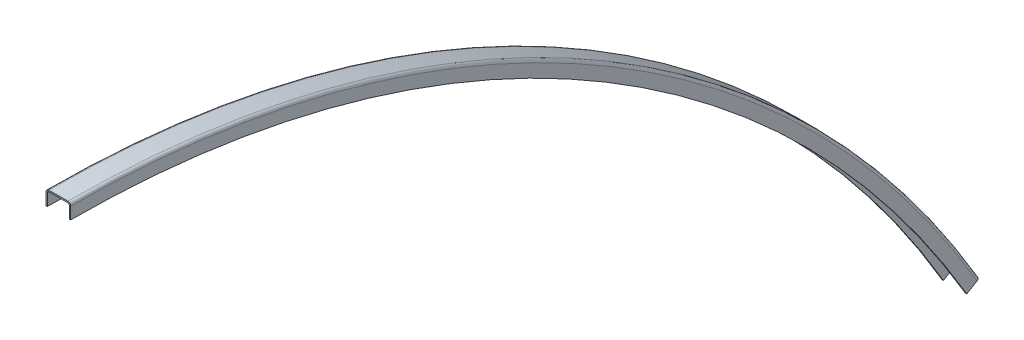
ISO-10303-21;
HEADER;
FILE_DESCRIPTION(('STEP AP214'),'2;1');
FILE_NAME('part.step','',(''),(''),'','','');
FILE_SCHEMA(('AUTOMOTIVE_DESIGN { 1 0 10303 214 1 1 1 1 }'));
ENDSEC;
DATA;
#1=APPLICATION_CONTEXT('core data for automotive mechanical design processes');
#2=APPLICATION_PROTOCOL_DEFINITION('international standard','automotive_design',2000,#1);
#3=PRODUCT_CONTEXT('',#1,'mechanical');
#4=PRODUCT('Part','Part','',(#3));
#5=PRODUCT_RELATED_PRODUCT_CATEGORY('part','',(#4));
#6=PRODUCT_DEFINITION_FORMATION('','',#4);
#7=PRODUCT_DEFINITION_CONTEXT('part definition',#1,'design');
#8=PRODUCT_DEFINITION('design','',#6,#7);
#9=PRODUCT_DEFINITION_SHAPE('','',#8);
#10=(LENGTH_UNIT() NAMED_UNIT(*) SI_UNIT(.MILLI.,.METRE.));
#11=(NAMED_UNIT(*) PLANE_ANGLE_UNIT() SI_UNIT($,.RADIAN.));
#12=(NAMED_UNIT(*) SI_UNIT($,.STERADIAN.) SOLID_ANGLE_UNIT());
#13=UNCERTAINTY_MEASURE_WITH_UNIT(LENGTH_MEASURE(1.E-05),#10,'distance_accuracy_value','');
#14=(GEOMETRIC_REPRESENTATION_CONTEXT(3) GLOBAL_UNCERTAINTY_ASSIGNED_CONTEXT((#13)) GLOBAL_UNIT_ASSIGNED_CONTEXT((#10,
#11,#12)) REPRESENTATION_CONTEXT('',''));
#15=CARTESIAN_POINT('',(0.,0.,0.));
#16=DIRECTION('',(0.,0.,1.));
#17=DIRECTION('',(1.,0.,0.));
#18=AXIS2_PLACEMENT_3D('',#15,#16,#17);
#19=CARTESIAN_POINT('',(14.479414078454,-1435.51851851852,0.));
#20=DIRECTION('',(1.,0.,0.));
#21=DIRECTION('',(0.,0.,-1.));
#22=AXIS2_PLACEMENT_3D('',#19,#20,#21);
#23=CYLINDRICAL_SURFACE('',#22,1473.5);
#24=CARTESIAN_POINT('',(-23.2037037037037,-1435.51851851852,0.));
#25=DIRECTION('',(1.,0.,0.));
#26=DIRECTION('',(0.,0.,-1.));
#27=AXIS2_PLACEMENT_3D('',#24,#25,#26);
#28=CIRCLE('',#27,1473.5);
#29=CARTESIAN_POINT('',(-23.2037037037037,-687.660740695924,-1269.61056791059));
#30=VERTEX_POINT('',#29);
#31=CARTESIAN_POINT('',(-23.2037037037037,37.9814814814815,0.));
#32=VERTEX_POINT('',#31);
#33=EDGE_CURVE('E11',#30,#32,#28,.T.);
#34=ORIENTED_EDGE('',*,*,#33,.F.);
#35=DIRECTION('',(1.,0.,0.));
#36=VECTOR('',#35,1.);
#37=CARTESIAN_POINT('',(-21.2037037037037,-687.660740695924,-1269.61056791059));
#38=LINE('',#37,#36);
#39=CARTESIAN_POINT('',(-21.2037037037037,-687.660740695924,-1269.61056791059));
#40=VERTEX_POINT('',#39);
#41=EDGE_CURVE('E129',#30,#40,#38,.T.);
#42=ORIENTED_EDGE('',*,*,#41,.T.);
#43=CARTESIAN_POINT('',(-21.2037037037037,-1435.51851851852,0.));
#44=DIRECTION('',(1.,0.,0.));
#45=DIRECTION('',(0.,0.,-1.));
#46=AXIS2_PLACEMENT_3D('',#43,#44,#45);
#47=CIRCLE('',#46,1473.5);
#48=CARTESIAN_POINT('',(-21.2037037037037,37.9814814814815,0.));
#49=VERTEX_POINT('',#48);
#50=EDGE_CURVE('E124',#40,#49,#47,.T.);
#51=ORIENTED_EDGE('',*,*,#50,.T.);
#52=DIRECTION('',(1.,0.,0.));
#53=VECTOR('',#52,1.);
#54=CARTESIAN_POINT('',(-21.2037037037037,37.9814814814815,0.));
#55=LINE('',#54,#53);
#56=EDGE_CURVE('E127',#32,#49,#55,.T.);
#57=ORIENTED_EDGE('',*,*,#56,.F.);
#58=EDGE_LOOP('',(#34,#42,#51,#57));
#59=FACE_BOUND('',#58,.T.);
#60=ADVANCED_FACE('F39',(#59),#23,.F.);
#61=CARTESIAN_POINT('',(-23.2037037037037,-687.660740695924,-1269.61056791059));
#62=DIRECTION('',(-1.,0.,0.));
#63=DIRECTION('',(0.,0.,1.));
#64=AXIS2_PLACEMENT_3D('',#61,#62,#63);
#65=PLANE('',#64);
#66=CARTESIAN_POINT('',(-23.2037037037037,-1435.51851851852,0.));
#67=DIRECTION('',(1.,0.,0.));
#68=DIRECTION('',(0.,0.,-1.));
#69=AXIS2_PLACEMENT_3D('',#66,#67,#68);
#70=CIRCLE('',#69,1490.5);
#71=CARTESIAN_POINT('',(-23.2037037037037,-679.032588525592,-1284.2582636381));
#72=VERTEX_POINT('',#71);
#73=CARTESIAN_POINT('',(-23.2037037037037,54.9814814814815,0.));
#74=VERTEX_POINT('',#73);
#75=EDGE_CURVE('E48',#72,#74,#70,.T.);
#76=ORIENTED_EDGE('',*,*,#75,.F.);
#77=DIRECTION('',(0.,-0.507538362960702,0.861629160441527));
#78=VECTOR('',#77,1.);
#79=CARTESIAN_POINT('',(-23.2037037037037,-687.660740695924,-1269.61056791059));
#80=LINE('',#79,#78);
#81=EDGE_CURVE('E135',#72,#30,#80,.T.);
#82=ORIENTED_EDGE('',*,*,#81,.T.);
#83=ORIENTED_EDGE('',*,*,#33,.T.);
#84=DIRECTION('',(0.,-1.,0.));
#85=VECTOR('',#84,1.);
#86=CARTESIAN_POINT('',(-23.2037037037037,37.9814814814815,0.));
#87=LINE('',#86,#85);
#88=EDGE_CURVE('E149',#74,#32,#87,.T.);
#89=ORIENTED_EDGE('',*,*,#88,.F.);
#90=EDGE_LOOP('',(#76,#82,#83,#89));
#91=FACE_BOUND('',#90,.T.);
#92=ADVANCED_FACE('F41',(#91),#65,.T.);
#93=CARTESIAN_POINT('',(-19.2037037037037,-1435.51851851852,0.));
#94=DIRECTION('',(1.,0.,0.));
#95=DIRECTION('',(0.,0.,-1.));
#96=AXIS2_PLACEMENT_3D('',#93,#94,#95);
#97=TOROIDAL_SURFACE('',#96,1490.5,4.);
#98=CARTESIAN_POINT('',(-19.2037037037037,-1435.51851851852,0.));
#99=DIRECTION('',(1.,0.,0.));
#100=DIRECTION('',(0.,0.,-1.));
#101=AXIS2_PLACEMENT_3D('',#98,#99,#100);
#102=CIRCLE('',#101,1494.5);
#103=CARTESIAN_POINT('',(-19.2037037037037,-677.002435073749,-1287.70478027986));
#104=VERTEX_POINT('',#103);
#105=CARTESIAN_POINT('',(-19.2037037037037,58.9814814814815,0.));
#106=VERTEX_POINT('',#105);
#107=EDGE_CURVE('E253',#104,#106,#102,.T.);
#108=ORIENTED_EDGE('',*,*,#107,.F.);
#109=CARTESIAN_POINT('',(-19.2037037037037,-679.032588525592,-1284.2582636381));
#110=DIRECTION('',(0.,0.861629160441527,0.507538362960702));
#111=DIRECTION('',(-1.,0.,0.));
#112=AXIS2_PLACEMENT_3D('',#109,#110,#111);
#113=CIRCLE('',#112,4.);
#114=EDGE_CURVE('E225',#104,#72,#113,.T.);
#115=ORIENTED_EDGE('',*,*,#114,.T.);
#116=ORIENTED_EDGE('',*,*,#75,.T.);
#117=CARTESIAN_POINT('',(-19.2037037037037,54.9814814814815,0.));
#118=DIRECTION('',(0.,0.,1.));
#119=DIRECTION('',(-1.,0.,0.));
#120=AXIS2_PLACEMENT_3D('',#117,#118,#119);
#121=CIRCLE('',#120,4.);
#122=EDGE_CURVE('E183',#106,#74,#121,.T.);
#123=ORIENTED_EDGE('',*,*,#122,.F.);
#124=EDGE_LOOP('',(#108,#115,#116,#123));
#125=FACE_BOUND('',#124,.T.);
#126=ADVANCED_FACE('F258',(#125),#97,.T.);
#127=CARTESIAN_POINT('',(14.479414078454,-1435.51851851852,0.));
#128=DIRECTION('',(1.,0.,0.));
#129=DIRECTION('',(0.,0.,-1.));
#130=AXIS2_PLACEMENT_3D('',#127,#128,#129);
#131=CYLINDRICAL_SURFACE('',#130,1494.5);
#132=CARTESIAN_POINT('',(7.79629629629627,-1435.51851851852,0.));
#133=DIRECTION('',(1.,0.,0.));
#134=DIRECTION('',(0.,0.,-1.));
#135=AXIS2_PLACEMENT_3D('',#132,#133,#134);
#136=CIRCLE('',#135,1494.5);
#137=CARTESIAN_POINT('',(7.79629629629627,-677.002435073749,-1287.70478027986));
#138=VERTEX_POINT('',#137);
#139=CARTESIAN_POINT('',(7.79629629629627,58.9814814814815,0.));
#140=VERTEX_POINT('',#139);
#141=EDGE_CURVE('E250',#138,#140,#136,.T.);
#142=ORIENTED_EDGE('',*,*,#141,.F.);
#143=DIRECTION('',(-1.,0.,0.));
#144=VECTOR('',#143,1.);
#145=CARTESIAN_POINT('',(-19.2037037037037,-677.002435073749,-1287.70478027986));
#146=LINE('',#145,#144);
#147=EDGE_CURVE('E221',#138,#104,#146,.T.);
#148=ORIENTED_EDGE('',*,*,#147,.T.);
#149=ORIENTED_EDGE('',*,*,#107,.T.);
#150=DIRECTION('',(-1.,0.,0.));
#151=VECTOR('',#150,1.);
#152=CARTESIAN_POINT('',(-19.2037037037037,58.9814814814815,0.));
#153=LINE('',#152,#151);
#154=EDGE_CURVE('E179',#140,#106,#153,.T.);
#155=ORIENTED_EDGE('',*,*,#154,.F.);
#156=EDGE_LOOP('',(#142,#148,#149,#155));
#157=FACE_BOUND('',#156,.T.);
#158=ADVANCED_FACE('F293',(#157),#131,.T.);
#159=CARTESIAN_POINT('',(7.79629629629629,-1435.51851851852,0.));
#160=DIRECTION('',(1.,0.,0.));
#161=DIRECTION('',(0.,0.,-1.));
#162=AXIS2_PLACEMENT_3D('',#159,#160,#161);
#163=TOROIDAL_SURFACE('',#162,1490.5,4.);
#164=CARTESIAN_POINT('',(11.7962962962963,-1435.51851851852,0.));
#165=DIRECTION('',(1.,0.,0.));
#166=DIRECTION('',(0.,0.,-1.));
#167=AXIS2_PLACEMENT_3D('',#164,#165,#166);
#168=CIRCLE('',#167,1490.5);
#169=CARTESIAN_POINT('',(11.7962962962963,-679.032588525592,-1284.2582636381));
#170=VERTEX_POINT('',#169);
#171=CARTESIAN_POINT('',(11.7962962962963,54.9814814814815,0.));
#172=VERTEX_POINT('',#171);
#173=EDGE_CURVE('E247',#170,#172,#168,.T.);
#174=ORIENTED_EDGE('',*,*,#173,.F.);
#175=CARTESIAN_POINT('',(7.79629629629629,-679.032588525592,-1284.2582636381));
#176=DIRECTION('',(0.,0.861629160441527,0.507538362960702));
#177=DIRECTION('',(-1.,0.,0.));
#178=AXIS2_PLACEMENT_3D('',#175,#176,#177);
#179=CIRCLE('',#178,4.);
#180=EDGE_CURVE('E217',#170,#138,#179,.T.);
#181=ORIENTED_EDGE('',*,*,#180,.T.);
#182=ORIENTED_EDGE('',*,*,#141,.T.);
#183=CARTESIAN_POINT('',(7.79629629629629,54.9814814814815,0.));
#184=DIRECTION('',(0.,0.,1.));
#185=DIRECTION('',(-1.,0.,0.));
#186=AXIS2_PLACEMENT_3D('',#183,#184,#185);
#187=CIRCLE('',#186,4.);
#188=EDGE_CURVE('E175',#172,#140,#187,.T.);
#189=ORIENTED_EDGE('',*,*,#188,.F.);
#190=EDGE_LOOP('',(#174,#181,#182,#189));
#191=FACE_BOUND('',#190,.T.);
#192=ADVANCED_FACE('F290',(#191),#163,.T.);
#193=CARTESIAN_POINT('',(11.7962962962963,-679.032588525592,-1284.2582636381));
#194=DIRECTION('',(1.,0.,0.));
#195=DIRECTION('',(0.,0.,-1.));
#196=AXIS2_PLACEMENT_3D('',#193,#194,#195);
#197=PLANE('',#196);
#198=CARTESIAN_POINT('',(11.7962962962963,-1435.51851851852,0.));
#199=DIRECTION('',(1.,0.,0.));
#200=DIRECTION('',(0.,0.,-1.));
#201=AXIS2_PLACEMENT_3D('',#198,#199,#200);
#202=CIRCLE('',#201,1473.5);
#203=CARTESIAN_POINT('',(11.7962962962963,-687.660740695924,-1269.61056791059));
#204=VERTEX_POINT('',#203);
#205=CARTESIAN_POINT('',(11.7962962962963,37.9814814814815,0.));
#206=VERTEX_POINT('',#205);
#207=EDGE_CURVE('E244',#204,#206,#202,.T.);
#208=ORIENTED_EDGE('',*,*,#207,.F.);
#209=DIRECTION('',(0.,0.507538362960702,-0.861629160441527));
#210=VECTOR('',#209,1.);
#211=CARTESIAN_POINT('',(11.7962962962963,-679.032588525592,-1284.2582636381));
#212=LINE('',#211,#210);
#213=EDGE_CURVE('E213',#204,#170,#212,.T.);
#214=ORIENTED_EDGE('',*,*,#213,.T.);
#215=ORIENTED_EDGE('',*,*,#173,.T.);
#216=DIRECTION('',(0.,1.,0.));
#217=VECTOR('',#216,1.);
#218=CARTESIAN_POINT('',(11.7962962962963,54.9814814814815,0.));
#219=LINE('',#218,#217);
#220=EDGE_CURVE('E171',#206,#172,#219,.T.);
#221=ORIENTED_EDGE('',*,*,#220,.F.);
#222=EDGE_LOOP('',(#208,#214,#215,#221));
#223=FACE_BOUND('',#222,.T.);
#224=ADVANCED_FACE('F287',(#223),#197,.T.);
#225=CARTESIAN_POINT('',(14.479414078454,-1435.51851851852,0.));
#226=DIRECTION('',(1.,0.,0.));
#227=DIRECTION('',(0.,0.,-1.));
#228=AXIS2_PLACEMENT_3D('',#225,#226,#227);
#229=CYLINDRICAL_SURFACE('',#228,1473.5);
#230=CARTESIAN_POINT('',(9.7962962962963,-1435.51851851852,0.));
#231=DIRECTION('',(1.,0.,0.));
#232=DIRECTION('',(0.,0.,-1.));
#233=AXIS2_PLACEMENT_3D('',#230,#231,#232);
#234=CIRCLE('',#233,1473.5);
#235=CARTESIAN_POINT('',(9.7962962962963,-687.660740695924,-1269.61056791059));
#236=VERTEX_POINT('',#235);
#237=CARTESIAN_POINT('',(9.7962962962963,37.9814814814815,0.));
#238=VERTEX_POINT('',#237);
#239=EDGE_CURVE('E241',#236,#238,#234,.T.);
#240=ORIENTED_EDGE('',*,*,#239,.F.);
#241=DIRECTION('',(1.,0.,0.));
#242=VECTOR('',#241,1.);
#243=CARTESIAN_POINT('',(11.7962962962963,-687.660740695924,-1269.61056791059));
#244=LINE('',#243,#242);
#245=EDGE_CURVE('E209',#236,#204,#244,.T.);
#246=ORIENTED_EDGE('',*,*,#245,.T.);
#247=ORIENTED_EDGE('',*,*,#207,.T.);
#248=DIRECTION('',(1.,0.,0.));
#249=VECTOR('',#248,1.);
#250=CARTESIAN_POINT('',(11.7962962962963,37.9814814814815,0.));
#251=LINE('',#250,#249);
#252=EDGE_CURVE('E167',#238,#206,#251,.T.);
#253=ORIENTED_EDGE('',*,*,#252,.F.);
#254=EDGE_LOOP('',(#240,#246,#247,#253));
#255=FACE_BOUND('',#254,.T.);
#256=ADVANCED_FACE('F282',(#255),#229,.F.);
#257=CARTESIAN_POINT('',(9.7962962962963,-687.660740695924,-1269.61056791059));
#258=DIRECTION('',(-1.,0.,0.));
#259=DIRECTION('',(0.,0.,1.));
#260=AXIS2_PLACEMENT_3D('',#257,#258,#259);
#261=PLANE('',#260);
#262=CARTESIAN_POINT('',(9.7962962962963,-1435.51851851852,0.));
#263=DIRECTION('',(1.,0.,0.));
#264=DIRECTION('',(0.,0.,-1.));
#265=AXIS2_PLACEMENT_3D('',#262,#263,#264);
#266=CIRCLE('',#265,1490.5);
#267=CARTESIAN_POINT('',(9.7962962962963,-679.032588525592,-1284.2582636381));
#268=VERTEX_POINT('',#267);
#269=CARTESIAN_POINT('',(9.7962962962963,54.9814814814815,0.));
#270=VERTEX_POINT('',#269);
#271=EDGE_CURVE('E238',#268,#270,#266,.T.);
#272=ORIENTED_EDGE('',*,*,#271,.F.);
#273=DIRECTION('',(0.,-0.507538362960702,0.861629160441527));
#274=VECTOR('',#273,1.);
#275=CARTESIAN_POINT('',(9.7962962962963,-687.660740695924,-1269.61056791059));
#276=LINE('',#275,#274);
#277=EDGE_CURVE('E205',#268,#236,#276,.T.);
#278=ORIENTED_EDGE('',*,*,#277,.T.);
#279=ORIENTED_EDGE('',*,*,#239,.T.);
#280=DIRECTION('',(0.,-1.,0.));
#281=VECTOR('',#280,1.);
#282=CARTESIAN_POINT('',(9.7962962962963,37.9814814814815,0.));
#283=LINE('',#282,#281);
#284=EDGE_CURVE('E163',#270,#238,#283,.T.);
#285=ORIENTED_EDGE('',*,*,#284,.F.);
#286=EDGE_LOOP('',(#272,#278,#279,#285));
#287=FACE_BOUND('',#286,.T.);
#288=ADVANCED_FACE('F279',(#287),#261,.T.);
#289=CARTESIAN_POINT('',(7.7962962962963,-1435.51851851852,0.));
#290=DIRECTION('',(1.,0.,0.));
#291=DIRECTION('',(0.,0.,-1.));
#292=AXIS2_PLACEMENT_3D('',#289,#290,#291);
#293=TOROIDAL_SURFACE('',#292,1490.5,2.);
#294=CARTESIAN_POINT('',(7.79629629629628,-1435.51851851852,0.));
#295=DIRECTION('',(1.,0.,0.));
#296=DIRECTION('',(0.,0.,-1.));
#297=AXIS2_PLACEMENT_3D('',#294,#295,#296);
#298=CIRCLE('',#297,1492.5);
#299=CARTESIAN_POINT('',(7.79629629629628,-678.01751179967,-1285.98152195898));
#300=VERTEX_POINT('',#299);
#301=CARTESIAN_POINT('',(7.79629629629628,56.9814814814815,0.));
#302=VERTEX_POINT('',#301);
#303=EDGE_CURVE('E235',#300,#302,#298,.T.);
#304=ORIENTED_EDGE('',*,*,#303,.F.);
#305=CARTESIAN_POINT('',(7.7962962962963,-679.032588525592,-1284.2582636381));
#306=DIRECTION('',(0.,-0.861629160441527,-0.507538362960702));
#307=DIRECTION('',(1.,0.,0.));
#308=AXIS2_PLACEMENT_3D('',#305,#306,#307);
#309=CIRCLE('',#308,2.);
#310=EDGE_CURVE('E201',#300,#268,#309,.T.);
#311=ORIENTED_EDGE('',*,*,#310,.T.);
#312=ORIENTED_EDGE('',*,*,#271,.T.);
#313=CARTESIAN_POINT('',(7.7962962962963,54.9814814814815,0.));
#314=DIRECTION('',(0.,0.,-1.));
#315=DIRECTION('',(1.,0.,0.));
#316=AXIS2_PLACEMENT_3D('',#313,#314,#315);
#317=CIRCLE('',#316,2.);
#318=EDGE_CURVE('E159',#302,#270,#317,.T.);
#319=ORIENTED_EDGE('',*,*,#318,.F.);
#320=EDGE_LOOP('',(#304,#311,#312,#319));
#321=FACE_BOUND('',#320,.T.);
#322=ADVANCED_FACE('F274',(#321),#293,.F.);
#323=CARTESIAN_POINT('',(14.479414078454,-1435.51851851852,0.));
#324=DIRECTION('',(1.,0.,0.));
#325=DIRECTION('',(0.,0.,-1.));
#326=AXIS2_PLACEMENT_3D('',#323,#324,#325);
#327=CYLINDRICAL_SURFACE('',#326,1492.5);
#328=CARTESIAN_POINT('',(-19.2037037037037,-1435.51851851852,0.));
#329=DIRECTION('',(1.,0.,0.));
#330=DIRECTION('',(0.,0.,-1.));
#331=AXIS2_PLACEMENT_3D('',#328,#329,#330);
#332=CIRCLE('',#331,1492.5);
#333=CARTESIAN_POINT('',(-19.2037037037037,-678.01751179967,-1285.98152195898));
#334=VERTEX_POINT('',#333);
#335=CARTESIAN_POINT('',(-19.2037037037037,56.9814814814815,0.));
#336=VERTEX_POINT('',#335);
#337=EDGE_CURVE('E232',#334,#336,#332,.T.);
#338=ORIENTED_EDGE('',*,*,#337,.F.);
#339=DIRECTION('',(1.,0.,0.));
#340=VECTOR('',#339,1.);
#341=CARTESIAN_POINT('',(7.79629629629628,-678.01751179967,-1285.98152195898));
#342=LINE('',#341,#340);
#343=EDGE_CURVE('E197',#334,#300,#342,.T.);
#344=ORIENTED_EDGE('',*,*,#343,.T.);
#345=ORIENTED_EDGE('',*,*,#303,.T.);
#346=DIRECTION('',(1.,0.,0.));
#347=VECTOR('',#346,1.);
#348=CARTESIAN_POINT('',(7.79629629629628,56.9814814814815,0.));
#349=LINE('',#348,#347);
#350=EDGE_CURVE('E155',#336,#302,#349,.T.);
#351=ORIENTED_EDGE('',*,*,#350,.F.);
#352=EDGE_LOOP('',(#338,#344,#345,#351));
#353=FACE_BOUND('',#352,.T.);
#354=ADVANCED_FACE('F272',(#353),#327,.F.);
#355=CARTESIAN_POINT('',(-19.2037037037037,-1435.51851851852,0.));
#356=DIRECTION('',(1.,0.,0.));
#357=DIRECTION('',(0.,0.,-1.));
#358=AXIS2_PLACEMENT_3D('',#355,#356,#357);
#359=TOROIDAL_SURFACE('',#358,1490.5,2.);
#360=CARTESIAN_POINT('',(-21.2037037037037,-1435.51851851852,0.));
#361=DIRECTION('',(1.,0.,0.));
#362=DIRECTION('',(0.,0.,-1.));
#363=AXIS2_PLACEMENT_3D('',#360,#361,#362);
#364=CIRCLE('',#363,1490.5);
#365=CARTESIAN_POINT('',(-21.2037037037037,-679.032588525592,-1284.2582636381));
#366=VERTEX_POINT('',#365);
#367=CARTESIAN_POINT('',(-21.2037037037037,54.9814814814815,0.));
#368=VERTEX_POINT('',#367);
#369=EDGE_CURVE('E134',#366,#368,#364,.T.);
#370=ORIENTED_EDGE('',*,*,#369,.F.);
#371=CARTESIAN_POINT('',(-19.2037037037037,-679.032588525592,-1284.2582636381));
#372=DIRECTION('',(0.,-0.861629160441527,-0.507538362960702));
#373=DIRECTION('',(-1.,0.,0.));
#374=AXIS2_PLACEMENT_3D('',#371,#372,#373);
#375=CIRCLE('',#374,2.);
#376=EDGE_CURVE('E193',#366,#334,#375,.T.);
#377=ORIENTED_EDGE('',*,*,#376,.T.);
#378=ORIENTED_EDGE('',*,*,#337,.T.);
#379=CARTESIAN_POINT('',(-19.2037037037037,54.9814814814815,0.));
#380=DIRECTION('',(0.,0.,-1.));
#381=DIRECTION('',(-1.,0.,0.));
#382=AXIS2_PLACEMENT_3D('',#379,#380,#381);
#383=CIRCLE('',#382,2.);
#384=EDGE_CURVE('E144',#368,#336,#383,.T.);
#385=ORIENTED_EDGE('',*,*,#384,.F.);
#386=EDGE_LOOP('',(#370,#377,#378,#385));
#387=FACE_BOUND('',#386,.T.);
#388=ADVANCED_FACE('F268',(#387),#359,.F.);
#389=CARTESIAN_POINT('',(-21.2037037037037,-679.032588525592,-1284.2582636381));
#390=DIRECTION('',(1.,0.,0.));
#391=DIRECTION('',(0.,0.,-1.));
#392=AXIS2_PLACEMENT_3D('',#389,#390,#391);
#393=PLANE('',#392);
#394=DIRECTION('',(0.,0.507538362960702,-0.861629160441527));
#395=VECTOR('',#394,1.);
#396=CARTESIAN_POINT('',(-21.2037037037037,-679.032588525592,-1284.2582636381));
#397=LINE('',#396,#395);
#398=EDGE_CURVE('E190',#40,#366,#397,.T.);
#399=ORIENTED_EDGE('',*,*,#398,.T.);
#400=ORIENTED_EDGE('',*,*,#369,.T.);
#401=DIRECTION('',(0.,1.,0.));
#402=VECTOR('',#401,1.);
#403=CARTESIAN_POINT('',(-21.2037037037037,54.9814814814815,0.));
#404=LINE('',#403,#402);
#405=EDGE_CURVE('E138',#49,#368,#404,.T.);
#406=ORIENTED_EDGE('',*,*,#405,.F.);
#407=ORIENTED_EDGE('',*,*,#50,.F.);
#408=EDGE_LOOP('',(#399,#400,#406,#407));
#409=FACE_BOUND('',#408,.T.);
#410=ADVANCED_FACE('F139',(#409),#393,.T.);
#411=CARTESIAN_POINT('',(-19.2037037037037,-679.032588525592,-1284.2582636381));
#412=DIRECTION('',(0.,-0.861629160441527,-0.507538362960702));
#413=DIRECTION('',(-1.,0.,0.));
#414=AXIS2_PLACEMENT_3D('',#411,#412,#413);
#415=PLANE('',#414);
#416=ORIENTED_EDGE('',*,*,#41,.F.);
#417=ORIENTED_EDGE('',*,*,#81,.F.);
#418=ORIENTED_EDGE('',*,*,#114,.F.);
#419=ORIENTED_EDGE('',*,*,#147,.F.);
#420=ORIENTED_EDGE('',*,*,#180,.F.);
#421=ORIENTED_EDGE('',*,*,#213,.F.);
#422=ORIENTED_EDGE('',*,*,#245,.F.);
#423=ORIENTED_EDGE('',*,*,#277,.F.);
#424=ORIENTED_EDGE('',*,*,#310,.F.);
#425=ORIENTED_EDGE('',*,*,#343,.F.);
#426=ORIENTED_EDGE('',*,*,#376,.F.);
#427=ORIENTED_EDGE('',*,*,#398,.F.);
#428=EDGE_LOOP('',(#416,#417,#418,#419,#420,#421,#422,#423,#424,#425,#426,#427));
#429=FACE_BOUND('',#428,.T.);
#430=ADVANCED_FACE('F263',(#429),#415,.T.);
#431=CARTESIAN_POINT('',(-19.2037037037037,54.9814814814815,0.));
#432=DIRECTION('',(0.,0.,-1.));
#433=DIRECTION('',(-1.,0.,0.));
#434=AXIS2_PLACEMENT_3D('',#431,#432,#433);
#435=PLANE('',#434);
#436=ORIENTED_EDGE('',*,*,#56,.T.);
#437=ORIENTED_EDGE('',*,*,#405,.T.);
#438=ORIENTED_EDGE('',*,*,#384,.T.);
#439=ORIENTED_EDGE('',*,*,#350,.T.);
#440=ORIENTED_EDGE('',*,*,#318,.T.);
#441=ORIENTED_EDGE('',*,*,#284,.T.);
#442=ORIENTED_EDGE('',*,*,#252,.T.);
#443=ORIENTED_EDGE('',*,*,#220,.T.);
#444=ORIENTED_EDGE('',*,*,#188,.T.);
#445=ORIENTED_EDGE('',*,*,#154,.T.);
#446=ORIENTED_EDGE('',*,*,#122,.T.);
#447=ORIENTED_EDGE('',*,*,#88,.T.);
#448=EDGE_LOOP('',(#436,#437,#438,#439,#440,#441,#442,#443,#444,#445,#446,#447));
#449=FACE_BOUND('',#448,.T.);
#450=ADVANCED_FACE('F147',(#449),#435,.F.);
#451=CLOSED_SHELL('',(#60,#92,#126,#158,#192,#224,#256,#288,#322,#354,#388,#410,#430,#450));
#452=MANIFOLD_SOLID_BREP('B2',#451);
#453=ADVANCED_BREP_SHAPE_REPRESENTATION('',(#18,#452),#14);
#454=SHAPE_DEFINITION_REPRESENTATION(#9,#453);
ENDSEC;
END-ISO-10303-21;
